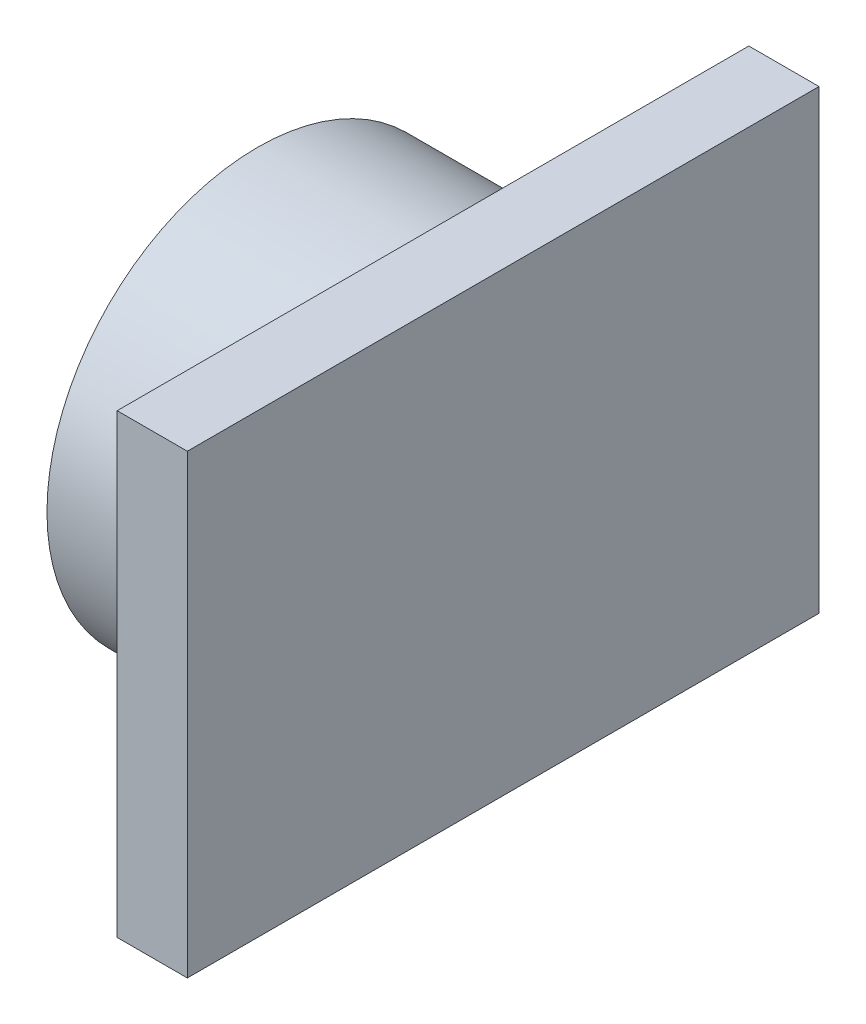
ISO-10303-21;
HEADER;
FILE_DESCRIPTION(('STEP AP214'),'2;1');
FILE_NAME('part.step','',(''),(''),'','','');
FILE_SCHEMA(('AUTOMOTIVE_DESIGN { 1 0 10303 214 1 1 1 1 }'));
ENDSEC;
DATA;
#1=APPLICATION_CONTEXT('core data for automotive mechanical design processes');
#2=APPLICATION_PROTOCOL_DEFINITION('international standard','automotive_design',2000,#1);
#3=PRODUCT_CONTEXT('',#1,'mechanical');
#4=PRODUCT('Part','Part','',(#3));
#5=PRODUCT_RELATED_PRODUCT_CATEGORY('part','',(#4));
#6=PRODUCT_DEFINITION_FORMATION('','',#4);
#7=PRODUCT_DEFINITION_CONTEXT('part definition',#1,'design');
#8=PRODUCT_DEFINITION('design','',#6,#7);
#9=PRODUCT_DEFINITION_SHAPE('','',#8);
#10=(LENGTH_UNIT() NAMED_UNIT(*) SI_UNIT(.MILLI.,.METRE.));
#11=(NAMED_UNIT(*) PLANE_ANGLE_UNIT() SI_UNIT($,.RADIAN.));
#12=(NAMED_UNIT(*) SI_UNIT($,.STERADIAN.) SOLID_ANGLE_UNIT());
#13=UNCERTAINTY_MEASURE_WITH_UNIT(LENGTH_MEASURE(1.E-05),#10,'distance_accuracy_value','');
#14=(GEOMETRIC_REPRESENTATION_CONTEXT(3) GLOBAL_UNCERTAINTY_ASSIGNED_CONTEXT((#13)) GLOBAL_UNIT_ASSIGNED_CONTEXT((#10,
#11,#12)) REPRESENTATION_CONTEXT('',''));
#15=CARTESIAN_POINT('',(0.,0.,0.));
#16=DIRECTION('',(0.,0.,1.));
#17=DIRECTION('',(1.,0.,0.));
#18=AXIS2_PLACEMENT_3D('',#15,#16,#17);
#19=CARTESIAN_POINT('',(-0.8,-4.34590093004928,16.5993653472046));
#20=DIRECTION('',(0.,0.,-1.));
#21=DIRECTION('',(-1.,0.,0.));
#22=AXIS2_PLACEMENT_3D('',#19,#20,#21);
#23=PLANE('',#22);
#24=DIRECTION('',(0.,1.,0.));
#25=VECTOR('',#24,1.);
#26=CARTESIAN_POINT('',(-0.4,-4.34590093004928,16.5993653472046));
#27=LINE('',#26,#25);
#28=CARTESIAN_POINT('',(-0.4,-4.34590093004928,16.5993653472046));
#29=VERTEX_POINT('',#28);
#30=CARTESIAN_POINT('',(-0.4,-1.74590093004928,16.5993653472046));
#31=VERTEX_POINT('',#30);
#32=EDGE_CURVE('E114',#29,#31,#27,.T.);
#33=ORIENTED_EDGE('',*,*,#32,.F.);
#34=DIRECTION('',(1.,0.,0.));
#35=VECTOR('',#34,1.);
#36=CARTESIAN_POINT('',(-0.8,-4.34590093004928,16.5993653472046));
#37=LINE('',#36,#35);
#38=CARTESIAN_POINT('',(-0.8,-4.34590093004928,16.5993653472046));
#39=VERTEX_POINT('',#38);
#40=EDGE_CURVE('E12',#39,#29,#37,.T.);
#41=ORIENTED_EDGE('',*,*,#40,.F.);
#42=DIRECTION('',(0.,1.,0.));
#43=VECTOR('',#42,1.);
#44=CARTESIAN_POINT('',(-0.8,-4.34590093004928,16.5993653472046));
#45=LINE('',#44,#43);
#46=CARTESIAN_POINT('',(-0.8,-1.74590093004928,16.5993653472046));
#47=VERTEX_POINT('',#46);
#48=EDGE_CURVE('E107',#39,#47,#45,.T.);
#49=ORIENTED_EDGE('',*,*,#48,.T.);
#50=DIRECTION('',(1.,0.,0.));
#51=VECTOR('',#50,1.);
#52=CARTESIAN_POINT('',(-0.8,-1.74590093004928,16.5993653472046));
#53=LINE('',#52,#51);
#54=EDGE_CURVE('E52',#47,#31,#53,.T.);
#55=ORIENTED_EDGE('',*,*,#54,.T.);
#56=EDGE_LOOP('',(#33,#41,#49,#55));
#57=FACE_BOUND('',#56,.T.);
#58=ADVANCED_FACE('F49',(#57),#23,.T.);
#59=CARTESIAN_POINT('',(-0.8,-4.34590093004928,16.5993653472046));
#60=DIRECTION('',(0.,-1.,0.));
#61=DIRECTION('',(0.,0.,-1.));
#62=AXIS2_PLACEMENT_3D('',#59,#60,#61);
#63=PLANE('',#62);
#64=DIRECTION('',(0.,0.,-1.));
#65=VECTOR('',#64,1.);
#66=CARTESIAN_POINT('',(-0.4,-4.34590093004928,16.5993653472046));
#67=LINE('',#66,#65);
#68=CARTESIAN_POINT('',(-0.4,-4.34590093004928,20.1993653472046));
#69=VERTEX_POINT('',#68);
#70=EDGE_CURVE('E109',#69,#29,#67,.T.);
#71=ORIENTED_EDGE('',*,*,#70,.F.);
#72=DIRECTION('',(1.,0.,0.));
#73=VECTOR('',#72,1.);
#74=CARTESIAN_POINT('',(-0.8,-4.34590093004928,20.1993653472046));
#75=LINE('',#74,#73);
#76=CARTESIAN_POINT('',(-0.8,-4.34590093004928,20.1993653472046));
#77=VERTEX_POINT('',#76);
#78=EDGE_CURVE('E58',#77,#69,#75,.T.);
#79=ORIENTED_EDGE('',*,*,#78,.F.);
#80=DIRECTION('',(0.,0.,-1.));
#81=VECTOR('',#80,1.);
#82=CARTESIAN_POINT('',(-0.8,-4.34590093004928,16.5993653472046));
#83=LINE('',#82,#81);
#84=EDGE_CURVE('E104',#77,#39,#83,.T.);
#85=ORIENTED_EDGE('',*,*,#84,.T.);
#86=ORIENTED_EDGE('',*,*,#40,.T.);
#87=EDGE_LOOP('',(#71,#79,#85,#86));
#88=FACE_BOUND('',#87,.T.);
#89=ADVANCED_FACE('F125',(#88),#63,.T.);
#90=CARTESIAN_POINT('',(-0.8,-4.34590093004928,20.1993653472046));
#91=DIRECTION('',(0.,0.,1.));
#92=DIRECTION('',(1.,0.,0.));
#93=AXIS2_PLACEMENT_3D('',#90,#91,#92);
#94=PLANE('',#93);
#95=DIRECTION('',(0.,-1.,0.));
#96=VECTOR('',#95,1.);
#97=CARTESIAN_POINT('',(-0.4,-4.34590093004928,20.1993653472046));
#98=LINE('',#97,#96);
#99=CARTESIAN_POINT('',(-0.4,-1.74590093004928,20.1993653472046));
#100=VERTEX_POINT('',#99);
#101=EDGE_CURVE('E99',#100,#69,#98,.T.);
#102=ORIENTED_EDGE('',*,*,#101,.F.);
#103=DIRECTION('',(1.,0.,0.));
#104=VECTOR('',#103,1.);
#105=CARTESIAN_POINT('',(-0.8,-1.74590093004928,20.1993653472046));
#106=LINE('',#105,#104);
#107=CARTESIAN_POINT('',(-0.8,-1.74590093004928,20.1993653472046));
#108=VERTEX_POINT('',#107);
#109=EDGE_CURVE('E94',#108,#100,#106,.T.);
#110=ORIENTED_EDGE('',*,*,#109,.F.);
#111=DIRECTION('',(0.,-1.,0.));
#112=VECTOR('',#111,1.);
#113=CARTESIAN_POINT('',(-0.8,-4.34590093004928,20.1993653472046));
#114=LINE('',#113,#112);
#115=EDGE_CURVE('E97',#108,#77,#114,.T.);
#116=ORIENTED_EDGE('',*,*,#115,.T.);
#117=ORIENTED_EDGE('',*,*,#78,.T.);
#118=EDGE_LOOP('',(#102,#110,#116,#117));
#119=FACE_BOUND('',#118,.T.);
#120=ADVANCED_FACE('F96',(#119),#94,.T.);
#121=CARTESIAN_POINT('',(-0.8,-1.74590093004928,16.5993653472046));
#122=DIRECTION('',(0.,1.,0.));
#123=DIRECTION('',(0.,0.,1.));
#124=AXIS2_PLACEMENT_3D('',#121,#122,#123);
#125=PLANE('',#124);
#126=DIRECTION('',(0.,0.,1.));
#127=VECTOR('',#126,1.);
#128=CARTESIAN_POINT('',(-0.4,-1.74590093004928,16.5993653472046));
#129=LINE('',#128,#127);
#130=EDGE_CURVE('E117',#31,#100,#129,.T.);
#131=ORIENTED_EDGE('',*,*,#130,.F.);
#132=ORIENTED_EDGE('',*,*,#54,.F.);
#133=DIRECTION('',(0.,0.,1.));
#134=VECTOR('',#133,1.);
#135=CARTESIAN_POINT('',(-0.8,-1.74590093004928,16.5993653472046));
#136=LINE('',#135,#134);
#137=EDGE_CURVE('E103',#47,#108,#136,.T.);
#138=ORIENTED_EDGE('',*,*,#137,.T.);
#139=ORIENTED_EDGE('',*,*,#109,.T.);
#140=EDGE_LOOP('',(#131,#132,#138,#139));
#141=FACE_BOUND('',#140,.T.);
#142=ADVANCED_FACE('F106',(#141),#125,.T.);
#143=CARTESIAN_POINT('',(-0.8,0.,0.));
#144=DIRECTION('',(1.,0.,0.));
#145=DIRECTION('',(0.,0.,-1.));
#146=AXIS2_PLACEMENT_3D('',#143,#144,#145);
#147=PLANE('',#146);
#148=CARTESIAN_POINT('',(-0.8,-3.04590093004928,18.3993653472046));
#149=DIRECTION('',(1.,0.,0.));
#150=DIRECTION('',(0.,0.,-1.));
#151=AXIS2_PLACEMENT_3D('',#148,#149,#150);
#152=CIRCLE('',#151,1.2);
#153=CARTESIAN_POINT('',(-0.8,-3.04590093004928,17.1993653472046));
#154=VERTEX_POINT('',#153);
#155=EDGE_CURVE('E156',#154,#154,#152,.T.);
#156=ORIENTED_EDGE('',*,*,#155,.T.);
#157=EDGE_LOOP('',(#156));
#158=FACE_BOUND('',#157,.T.);
#159=ORIENTED_EDGE('',*,*,#48,.F.);
#160=ORIENTED_EDGE('',*,*,#84,.F.);
#161=ORIENTED_EDGE('',*,*,#115,.F.);
#162=ORIENTED_EDGE('',*,*,#137,.F.);
#163=EDGE_LOOP('',(#159,#160,#161,#162));
#164=FACE_BOUND('',#163,.T.);
#165=ADVANCED_FACE('F102',(#158,#164),#147,.F.);
#166=CARTESIAN_POINT('',(-0.4,0.,0.));
#167=DIRECTION('',(1.,0.,0.));
#168=DIRECTION('',(0.,0.,-1.));
#169=AXIS2_PLACEMENT_3D('',#166,#167,#168);
#170=PLANE('',#169);
#171=ORIENTED_EDGE('',*,*,#32,.T.);
#172=ORIENTED_EDGE('',*,*,#130,.T.);
#173=ORIENTED_EDGE('',*,*,#101,.T.);
#174=ORIENTED_EDGE('',*,*,#70,.T.);
#175=EDGE_LOOP('',(#171,#172,#173,#174));
#176=FACE_BOUND('',#175,.T.);
#177=ADVANCED_FACE('F124',(#176),#170,.T.);
#178=CARTESIAN_POINT('',(-1.8,-3.04590093004928,18.3993653472046));
#179=DIRECTION('',(1.,0.,0.));
#180=DIRECTION('',(0.,0.,-1.));
#181=AXIS2_PLACEMENT_3D('',#178,#179,#180);
#182=CYLINDRICAL_SURFACE('',#181,1.2);
#183=CARTESIAN_POINT('',(-1.8,-3.04590093004928,18.3993653472046));
#184=DIRECTION('',(1.,0.,0.));
#185=DIRECTION('',(0.,0.,-1.));
#186=AXIS2_PLACEMENT_3D('',#183,#184,#185);
#187=CIRCLE('',#186,1.2);
#188=CARTESIAN_POINT('',(-1.8,-3.04590093004928,17.1993653472046));
#189=VERTEX_POINT('',#188);
#190=EDGE_CURVE('E118',#189,#189,#187,.T.);
#191=ORIENTED_EDGE('',*,*,#190,.T.);
#192=EDGE_LOOP('',(#191));
#193=FACE_BOUND('',#192,.T.);
#194=ORIENTED_EDGE('',*,*,#155,.F.);
#195=EDGE_LOOP('',(#194));
#196=FACE_BOUND('',#195,.T.);
#197=ADVANCED_FACE('F143',(#193,#196),#182,.T.);
#198=CARTESIAN_POINT('',(-1.8,-3.04590093004928,18.3993653472046));
#199=DIRECTION('',(1.,0.,0.));
#200=DIRECTION('',(0.,0.,-1.));
#201=AXIS2_PLACEMENT_3D('',#198,#199,#200);
#202=PLANE('',#201);
#203=ORIENTED_EDGE('',*,*,#190,.F.);
#204=EDGE_LOOP('',(#203));
#205=FACE_BOUND('',#204,.T.);
#206=ADVANCED_FACE('F148',(#205),#202,.F.);
#207=CLOSED_SHELL('',(#58,#89,#120,#142,#165,#177,#197,#206));
#208=MANIFOLD_SOLID_BREP('B2',#207);
#209=ADVANCED_BREP_SHAPE_REPRESENTATION('',(#18,#208),#14);
#210=SHAPE_DEFINITION_REPRESENTATION(#9,#209);
ENDSEC;
END-ISO-10303-21;
